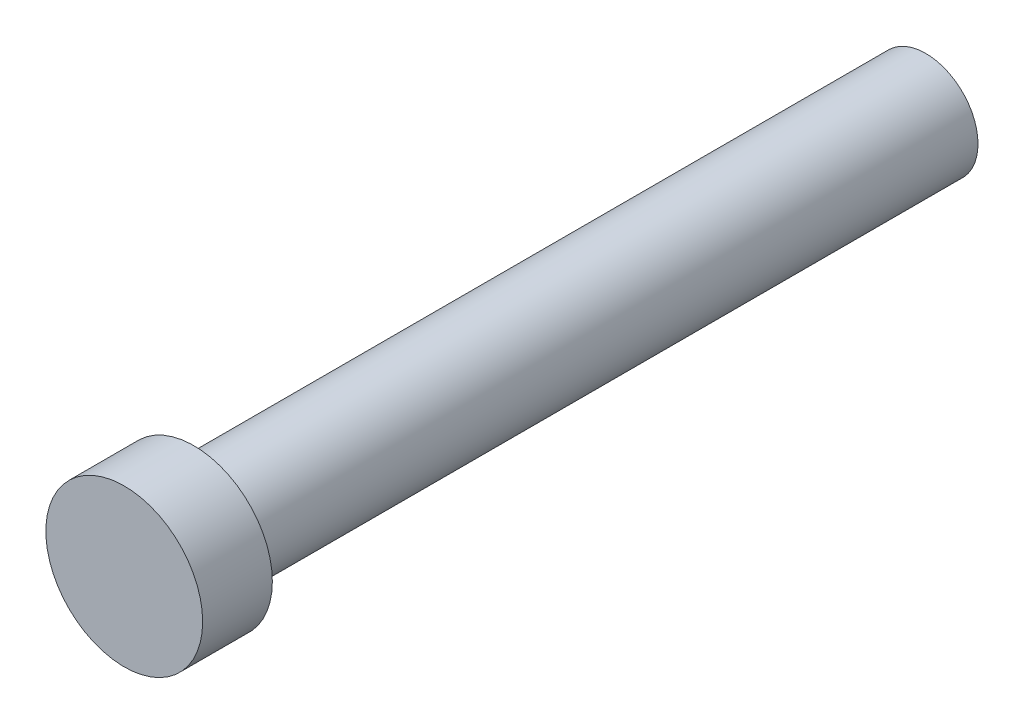
ISO-10303-21;
HEADER;
FILE_DESCRIPTION(('STEP AP214'),'2;1');
FILE_NAME('part.step','',(''),(''),'','','');
FILE_SCHEMA(('AUTOMOTIVE_DESIGN { 1 0 10303 214 1 1 1 1 }'));
ENDSEC;
DATA;
#1=APPLICATION_CONTEXT('core data for automotive mechanical design processes');
#2=APPLICATION_PROTOCOL_DEFINITION('international standard','automotive_design',2000,#1);
#3=PRODUCT_CONTEXT('',#1,'mechanical');
#4=PRODUCT('Part','Part','',(#3));
#5=PRODUCT_RELATED_PRODUCT_CATEGORY('part','',(#4));
#6=PRODUCT_DEFINITION_FORMATION('','',#4);
#7=PRODUCT_DEFINITION_CONTEXT('part definition',#1,'design');
#8=PRODUCT_DEFINITION('design','',#6,#7);
#9=PRODUCT_DEFINITION_SHAPE('','',#8);
#10=(LENGTH_UNIT() NAMED_UNIT(*) SI_UNIT(.MILLI.,.METRE.));
#11=(NAMED_UNIT(*) PLANE_ANGLE_UNIT() SI_UNIT($,.RADIAN.));
#12=(NAMED_UNIT(*) SI_UNIT($,.STERADIAN.) SOLID_ANGLE_UNIT());
#13=UNCERTAINTY_MEASURE_WITH_UNIT(LENGTH_MEASURE(1.E-05),#10,'distance_accuracy_value','');
#14=(GEOMETRIC_REPRESENTATION_CONTEXT(3) GLOBAL_UNCERTAINTY_ASSIGNED_CONTEXT((#13)) GLOBAL_UNIT_ASSIGNED_CONTEXT((#10,
#11,#12)) REPRESENTATION_CONTEXT('',''));
#15=CARTESIAN_POINT('',(0.,0.,0.));
#16=DIRECTION('',(0.,0.,1.));
#17=DIRECTION('',(1.,0.,0.));
#18=AXIS2_PLACEMENT_3D('',#15,#16,#17);
#19=CARTESIAN_POINT('',(0.,0.,20.));
#20=DIRECTION('',(0.,0.,-1.));
#21=DIRECTION('',(-1.,0.,0.));
#22=AXIS2_PLACEMENT_3D('',#19,#20,#21);
#23=CYLINDRICAL_SURFACE('',#22,22.5);
#24=CARTESIAN_POINT('',(0.,0.,20.));
#25=DIRECTION('',(0.,0.,1.));
#26=DIRECTION('',(1.,0.,0.));
#27=AXIS2_PLACEMENT_3D('',#24,#25,#26);
#28=CIRCLE('',#27,22.5);
#29=CARTESIAN_POINT('',(22.5,0.,20.));
#30=VERTEX_POINT('',#29);
#31=EDGE_CURVE('E10',#30,#30,#28,.T.);
#32=ORIENTED_EDGE('',*,*,#31,.F.);
#33=EDGE_LOOP('',(#32));
#34=FACE_BOUND('',#33,.T.);
#35=CARTESIAN_POINT('',(0.,0.,0.));
#36=DIRECTION('',(0.,0.,1.));
#37=DIRECTION('',(1.,0.,0.));
#38=AXIS2_PLACEMENT_3D('',#35,#36,#37);
#39=CIRCLE('',#38,22.5);
#40=CARTESIAN_POINT('',(22.5,0.,0.));
#41=VERTEX_POINT('',#40);
#42=EDGE_CURVE('E37',#41,#41,#39,.T.);
#43=ORIENTED_EDGE('',*,*,#42,.T.);
#44=EDGE_LOOP('',(#43));
#45=FACE_BOUND('',#44,.T.);
#46=ADVANCED_FACE('F34',(#34,#45),#23,.T.);
#47=CARTESIAN_POINT('',(0.,0.,20.));
#48=DIRECTION('',(0.,0.,1.));
#49=DIRECTION('',(1.,0.,0.));
#50=AXIS2_PLACEMENT_3D('',#47,#48,#49);
#51=PLANE('',#50);
#52=ORIENTED_EDGE('',*,*,#31,.T.);
#53=EDGE_LOOP('',(#52));
#54=FACE_BOUND('',#53,.T.);
#55=ADVANCED_FACE('F64',(#54),#51,.T.);
#56=CARTESIAN_POINT('',(0.,0.,0.));
#57=DIRECTION('',(0.,0.,1.));
#58=DIRECTION('',(1.,0.,0.));
#59=AXIS2_PLACEMENT_3D('',#56,#57,#58);
#60=PLANE('',#59);
#61=CARTESIAN_POINT('',(0.,0.,0.));
#62=DIRECTION('',(0.,0.,1.));
#63=DIRECTION('',(1.,0.,0.));
#64=AXIS2_PLACEMENT_3D('',#61,#62,#63);
#65=CIRCLE('',#64,15.);
#66=CARTESIAN_POINT('',(15.,0.,0.));
#67=VERTEX_POINT('',#66);
#68=EDGE_CURVE('E44',#67,#67,#65,.T.);
#69=ORIENTED_EDGE('',*,*,#68,.T.);
#70=EDGE_LOOP('',(#69));
#71=FACE_BOUND('',#70,.T.);
#72=ORIENTED_EDGE('',*,*,#42,.F.);
#73=EDGE_LOOP('',(#72));
#74=FACE_BOUND('',#73,.T.);
#75=ADVANCED_FACE('F60',(#71,#74),#60,.F.);
#76=CARTESIAN_POINT('',(0.,0.,38.4034487117264));
#77=DIRECTION('',(0.,0.,1.));
#78=DIRECTION('',(1.,0.,0.));
#79=AXIS2_PLACEMENT_3D('',#76,#77,#78);
#80=CYLINDRICAL_SURFACE('',#79,15.);
#81=ORIENTED_EDGE('',*,*,#68,.F.);
#82=EDGE_LOOP('',(#81));
#83=FACE_BOUND('',#82,.T.);
#84=CARTESIAN_POINT('',(0.,0.,-210.));
#85=DIRECTION('',(0.,0.,1.));
#86=DIRECTION('',(1.,0.,0.));
#87=AXIS2_PLACEMENT_3D('',#84,#85,#86);
#88=CIRCLE('',#87,15.);
#89=CARTESIAN_POINT('',(15.,0.,-210.));
#90=VERTEX_POINT('',#89);
#91=EDGE_CURVE('E48',#90,#90,#88,.T.);
#92=ORIENTED_EDGE('',*,*,#91,.T.);
#93=EDGE_LOOP('',(#92));
#94=FACE_BOUND('',#93,.T.);
#95=ADVANCED_FACE('F52',(#83,#94),#80,.T.);
#96=CARTESIAN_POINT('',(0.,15.,-210.));
#97=DIRECTION('',(0.,0.,1.));
#98=DIRECTION('',(1.,0.,0.));
#99=AXIS2_PLACEMENT_3D('',#96,#97,#98);
#100=PLANE('',#99);
#101=ORIENTED_EDGE('',*,*,#91,.F.);
#102=EDGE_LOOP('',(#101));
#103=FACE_BOUND('',#102,.T.);
#104=ADVANCED_FACE('F54',(#103),#100,.F.);
#105=CLOSED_SHELL('',(#46,#55,#75,#95,#104));
#106=MANIFOLD_SOLID_BREP('B2',#105);
#107=ADVANCED_BREP_SHAPE_REPRESENTATION('',(#18,#106),#14);
#108=SHAPE_DEFINITION_REPRESENTATION(#9,#107);
ENDSEC;
END-ISO-10303-21;
